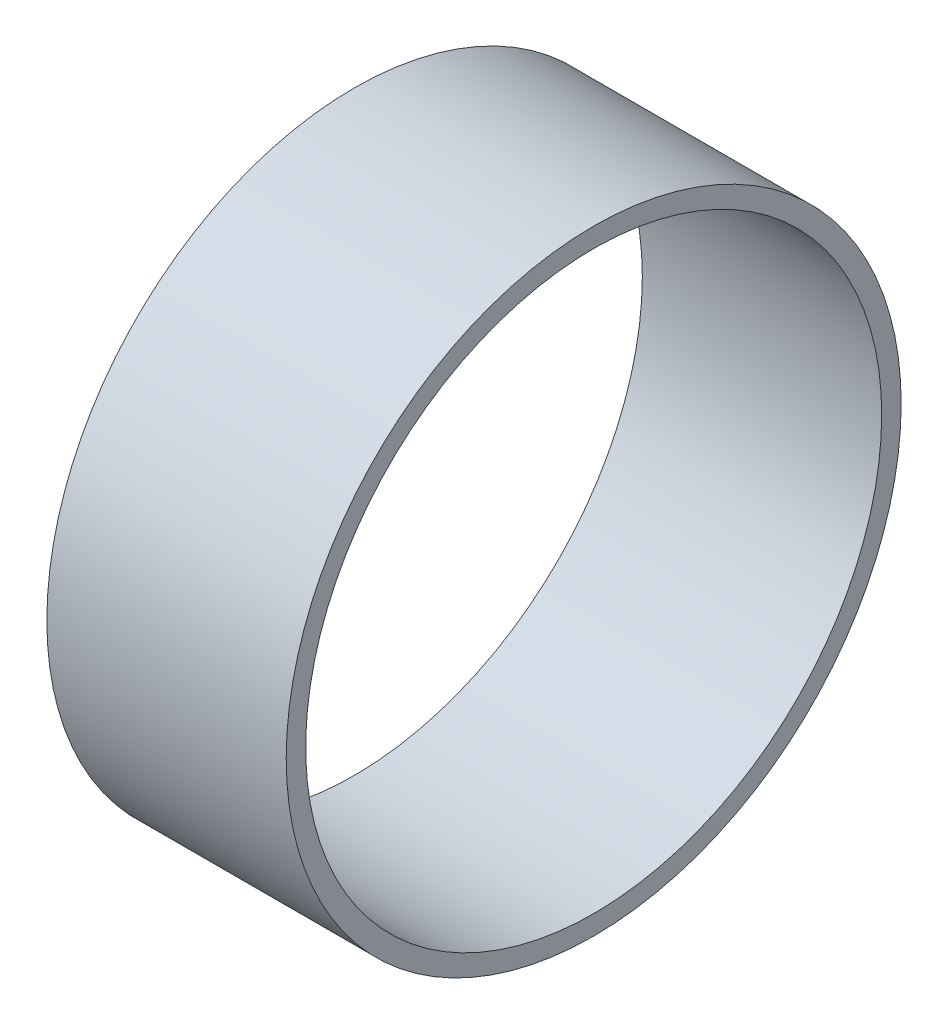
ISO-10303-21;
HEADER;
FILE_DESCRIPTION(('STEP AP214'),'2;1');
FILE_NAME('part.step','',(''),(''),'','','');
FILE_SCHEMA(('AUTOMOTIVE_DESIGN { 1 0 10303 214 1 1 1 1 }'));
ENDSEC;
DATA;
#1=APPLICATION_CONTEXT('core data for automotive mechanical design processes');
#2=APPLICATION_PROTOCOL_DEFINITION('international standard','automotive_design',2000,#1);
#3=PRODUCT_CONTEXT('',#1,'mechanical');
#4=PRODUCT('Part','Part','',(#3));
#5=PRODUCT_RELATED_PRODUCT_CATEGORY('part','',(#4));
#6=PRODUCT_DEFINITION_FORMATION('','',#4);
#7=PRODUCT_DEFINITION_CONTEXT('part definition',#1,'design');
#8=PRODUCT_DEFINITION('design','',#6,#7);
#9=PRODUCT_DEFINITION_SHAPE('','',#8);
#10=(LENGTH_UNIT() NAMED_UNIT(*) SI_UNIT(.MILLI.,.METRE.));
#11=(NAMED_UNIT(*) PLANE_ANGLE_UNIT() SI_UNIT($,.RADIAN.));
#12=(NAMED_UNIT(*) SI_UNIT($,.STERADIAN.) SOLID_ANGLE_UNIT());
#13=UNCERTAINTY_MEASURE_WITH_UNIT(LENGTH_MEASURE(1.E-05),#10,'distance_accuracy_value','');
#14=(GEOMETRIC_REPRESENTATION_CONTEXT(3) GLOBAL_UNCERTAINTY_ASSIGNED_CONTEXT((#13)) GLOBAL_UNIT_ASSIGNED_CONTEXT((#10,
#11,#12)) REPRESENTATION_CONTEXT('',''));
#15=CARTESIAN_POINT('',(0.,0.,0.));
#16=DIRECTION('',(0.,0.,1.));
#17=DIRECTION('',(1.,0.,0.));
#18=AXIS2_PLACEMENT_3D('',#15,#16,#17);
#19=CARTESIAN_POINT('',(74.265,0.,0.));
#20=DIRECTION('',(1.,0.,0.));
#21=DIRECTION('',(0.,0.,-1.));
#22=AXIS2_PLACEMENT_3D('',#19,#20,#21);
#23=CYLINDRICAL_SURFACE('',#22,7.4);
#24=CARTESIAN_POINT('',(71.19,0.,0.));
#25=DIRECTION('',(1.,0.,0.));
#26=DIRECTION('',(0.,0.,-1.));
#27=AXIS2_PLACEMENT_3D('',#24,#25,#26);
#28=CIRCLE('',#27,7.4);
#29=CARTESIAN_POINT('',(71.19,0.,-7.4));
#30=VERTEX_POINT('',#29);
#31=EDGE_CURVE('E18',#30,#30,#28,.T.);
#32=ORIENTED_EDGE('',*,*,#31,.F.);
#33=EDGE_LOOP('',(#32));
#34=FACE_BOUND('',#33,.T.);
#35=CARTESIAN_POINT('',(77.34,0.,0.));
#36=DIRECTION('',(1.,0.,0.));
#37=DIRECTION('',(0.,0.,-1.));
#38=AXIS2_PLACEMENT_3D('',#35,#36,#37);
#39=CIRCLE('',#38,7.4);
#40=CARTESIAN_POINT('',(77.34,0.,-7.4));
#41=VERTEX_POINT('',#40);
#42=EDGE_CURVE('E27',#41,#41,#39,.F.);
#43=ORIENTED_EDGE('',*,*,#42,.F.);
#44=EDGE_LOOP('',(#43));
#45=FACE_BOUND('',#44,.T.);
#46=ADVANCED_FACE('F15',(#34,#45),#23,.F.);
#47=CARTESIAN_POINT('',(71.19,0.,7.65));
#48=DIRECTION('',(-1.,0.,0.));
#49=DIRECTION('',(0.,0.,1.));
#50=AXIS2_PLACEMENT_3D('',#47,#48,#49);
#51=PLANE('',#50);
#52=ORIENTED_EDGE('',*,*,#31,.T.);
#53=EDGE_LOOP('',(#52));
#54=FACE_BOUND('',#53,.T.);
#55=CARTESIAN_POINT('',(71.19,0.,0.));
#56=DIRECTION('',(1.,0.,0.));
#57=DIRECTION('',(0.,0.,-1.));
#58=AXIS2_PLACEMENT_3D('',#55,#56,#57);
#59=CIRCLE('',#58,7.9);
#60=CARTESIAN_POINT('',(71.19,0.,-7.9));
#61=VERTEX_POINT('',#60);
#62=EDGE_CURVE('E22',#61,#61,#59,.T.);
#63=ORIENTED_EDGE('',*,*,#62,.F.);
#64=EDGE_LOOP('',(#63));
#65=FACE_BOUND('',#64,.T.);
#66=ADVANCED_FACE('F35',(#54,#65),#51,.T.);
#67=CARTESIAN_POINT('',(77.34,0.,7.65));
#68=DIRECTION('',(1.,0.,0.));
#69=DIRECTION('',(0.,0.,-1.));
#70=AXIS2_PLACEMENT_3D('',#67,#68,#69);
#71=PLANE('',#70);
#72=CARTESIAN_POINT('',(77.34,0.,0.));
#73=DIRECTION('',(1.,0.,0.));
#74=DIRECTION('',(0.,0.,-1.));
#75=AXIS2_PLACEMENT_3D('',#72,#73,#74);
#76=CIRCLE('',#75,7.9);
#77=CARTESIAN_POINT('',(77.34,0.,-7.9));
#78=VERTEX_POINT('',#77);
#79=EDGE_CURVE('E10',#78,#78,#76,.F.);
#80=ORIENTED_EDGE('',*,*,#79,.F.);
#81=EDGE_LOOP('',(#80));
#82=FACE_BOUND('',#81,.T.);
#83=ORIENTED_EDGE('',*,*,#42,.T.);
#84=EDGE_LOOP('',(#83));
#85=FACE_BOUND('',#84,.T.);
#86=ADVANCED_FACE('F44',(#82,#85),#71,.T.);
#87=CARTESIAN_POINT('',(74.265,0.,0.));
#88=DIRECTION('',(1.,0.,0.));
#89=DIRECTION('',(0.,0.,-1.));
#90=AXIS2_PLACEMENT_3D('',#87,#88,#89);
#91=CYLINDRICAL_SURFACE('',#90,7.9);
#92=ORIENTED_EDGE('',*,*,#62,.T.);
#93=EDGE_LOOP('',(#92));
#94=FACE_BOUND('',#93,.T.);
#95=ORIENTED_EDGE('',*,*,#79,.T.);
#96=EDGE_LOOP('',(#95));
#97=FACE_BOUND('',#96,.T.);
#98=ADVANCED_FACE('F45',(#94,#97),#91,.T.);
#99=CLOSED_SHELL('',(#46,#66,#86,#98));
#100=MANIFOLD_SOLID_BREP('B1',#99);
#101=ADVANCED_BREP_SHAPE_REPRESENTATION('',(#18,#100),#14);
#102=SHAPE_DEFINITION_REPRESENTATION(#9,#101);
ENDSEC;
END-ISO-10303-21;
